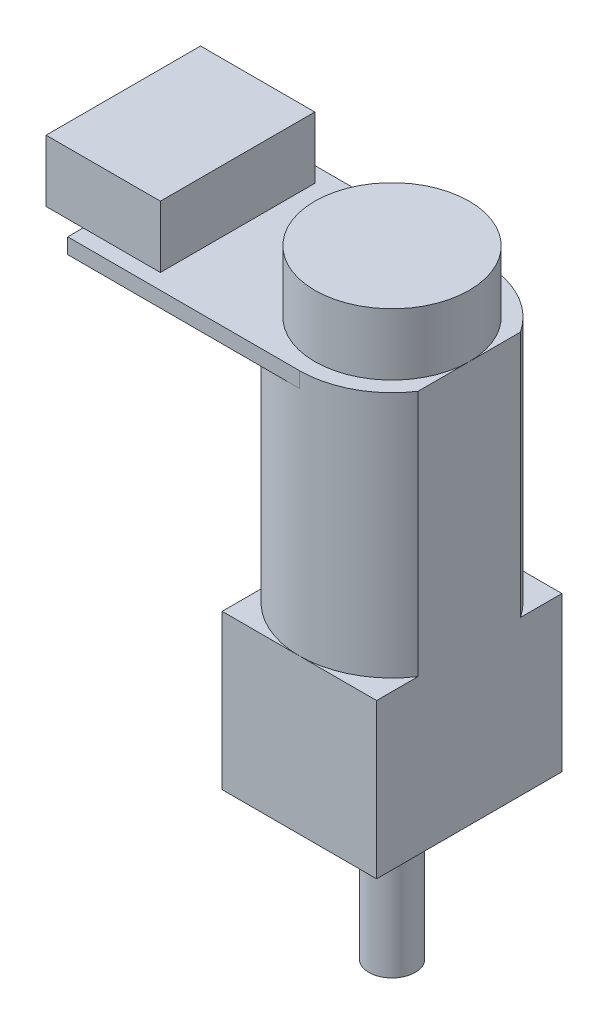
ISO-10303-21;
HEADER;
FILE_DESCRIPTION(('STEP AP214'),'2;1');
FILE_NAME('part.step','',(''),(''),'','','');
FILE_SCHEMA(('AUTOMOTIVE_DESIGN { 1 0 10303 214 1 1 1 1 }'));
ENDSEC;
DATA;
#1=APPLICATION_CONTEXT('core data for automotive mechanical design processes');
#2=APPLICATION_PROTOCOL_DEFINITION('international standard','automotive_design',2000,#1);
#3=PRODUCT_CONTEXT('',#1,'mechanical');
#4=PRODUCT('Part','Part','',(#3));
#5=PRODUCT_RELATED_PRODUCT_CATEGORY('part','',(#4));
#6=PRODUCT_DEFINITION_FORMATION('','',#4);
#7=PRODUCT_DEFINITION_CONTEXT('part definition',#1,'design');
#8=PRODUCT_DEFINITION('design','',#6,#7);
#9=PRODUCT_DEFINITION_SHAPE('','',#8);
#10=(LENGTH_UNIT() NAMED_UNIT(*) SI_UNIT(.MILLI.,.METRE.));
#11=(NAMED_UNIT(*) PLANE_ANGLE_UNIT() SI_UNIT($,.RADIAN.));
#12=(NAMED_UNIT(*) SI_UNIT($,.STERADIAN.) SOLID_ANGLE_UNIT());
#13=UNCERTAINTY_MEASURE_WITH_UNIT(LENGTH_MEASURE(1.E-05),#10,'distance_accuracy_value','');
#14=(GEOMETRIC_REPRESENTATION_CONTEXT(3) GLOBAL_UNCERTAINTY_ASSIGNED_CONTEXT((#13)) GLOBAL_UNIT_ASSIGNED_CONTEXT((#10,
#11,#12)) REPRESENTATION_CONTEXT('',''));
#15=CARTESIAN_POINT('',(0.,0.,0.));
#16=DIRECTION('',(0.,0.,1.));
#17=DIRECTION('',(1.,0.,0.));
#18=AXIS2_PLACEMENT_3D('',#15,#16,#17);
#19=CARTESIAN_POINT('',(0.,16.,0.));
#20=DIRECTION('',(0.,1.,0.));
#21=DIRECTION('',(0.,0.,1.));
#22=AXIS2_PLACEMENT_3D('',#19,#20,#21);
#23=PLANE('',#22);
#24=DIRECTION('',(0.,0.,-1.));
#25=VECTOR('',#24,1.);
#26=CARTESIAN_POINT('',(-10.,16.,-5.));
#27=LINE('',#26,#25);
#28=CARTESIAN_POINT('',(-10.,16.,5.));
#29=VERTEX_POINT('',#28);
#30=CARTESIAN_POINT('',(-10.,16.,-5.));
#31=VERTEX_POINT('',#30);
#32=EDGE_CURVE('E264',#29,#31,#27,.T.);
#33=ORIENTED_EDGE('',*,*,#32,.F.);
#34=DIRECTION('',(-1.,0.,0.));
#35=VECTOR('',#34,1.);
#36=CARTESIAN_POINT('',(0.,16.,5.));
#37=LINE('',#36,#35);
#38=CARTESIAN_POINT('',(-15.,16.,5.));
#39=VERTEX_POINT('',#38);
#40=EDGE_CURVE('E12',#29,#39,#37,.T.);
#41=ORIENTED_EDGE('',*,*,#40,.T.);
#42=DIRECTION('',(0.,0.,1.));
#43=VECTOR('',#42,1.);
#44=CARTESIAN_POINT('',(-15.,16.,6.));
#45=LINE('',#44,#43);
#46=CARTESIAN_POINT('',(-15.,16.,6.));
#47=VERTEX_POINT('',#46);
#48=EDGE_CURVE('E375',#39,#47,#45,.T.);
#49=ORIENTED_EDGE('',*,*,#48,.T.);
#50=DIRECTION('',(1.,0.,0.));
#51=VECTOR('',#50,1.);
#52=CARTESIAN_POINT('',(0.,16.,6.));
#53=LINE('',#52,#51);
#54=CARTESIAN_POINT('',(0.,16.,6.));
#55=VERTEX_POINT('',#54);
#56=EDGE_CURVE('E380',#47,#55,#53,.T.);
#57=ORIENTED_EDGE('',*,*,#56,.T.);
#58=CARTESIAN_POINT('',(0.,16.,0.));
#59=DIRECTION('',(0.,1.,0.));
#60=DIRECTION('',(0.,0.,1.));
#61=AXIS2_PLACEMENT_3D('',#58,#59,#60);
#62=CIRCLE('',#61,6.);
#63=CARTESIAN_POINT('',(5.,16.,3.3166247903554));
#64=VERTEX_POINT('',#63);
#65=EDGE_CURVE('E360',#55,#64,#62,.T.);
#66=ORIENTED_EDGE('',*,*,#65,.T.);
#67=DIRECTION('',(0.,0.,-1.));
#68=VECTOR('',#67,1.);
#69=CARTESIAN_POINT('',(5.,16.,3.3166247903554));
#70=LINE('',#69,#68);
#71=CARTESIAN_POINT('',(5.,16.,0.));
#72=VERTEX_POINT('',#71);
#73=EDGE_CURVE('E366',#64,#72,#70,.T.);
#74=ORIENTED_EDGE('',*,*,#73,.T.);
#75=CARTESIAN_POINT('',(0.,16.,0.));
#76=DIRECTION('',(0.,1.,0.));
#77=DIRECTION('',(0.,0.,1.));
#78=AXIS2_PLACEMENT_3D('',#75,#76,#77);
#79=CIRCLE('',#78,5.);
#80=EDGE_CURVE('E283',#72,#72,#79,.T.);
#81=ORIENTED_EDGE('',*,*,#80,.F.);
#82=CARTESIAN_POINT('',(5.,16.,-3.3166247903554));
#83=VERTEX_POINT('',#82);
#84=EDGE_CURVE('E364',#72,#83,#70,.T.);
#85=ORIENTED_EDGE('',*,*,#84,.T.);
#86=CARTESIAN_POINT('',(0.,16.,0.));
#87=DIRECTION('',(0.,1.,0.));
#88=DIRECTION('',(0.,0.,1.));
#89=AXIS2_PLACEMENT_3D('',#86,#87,#88);
#90=CIRCLE('',#89,6.);
#91=CARTESIAN_POINT('',(0.,16.,-6.));
#92=VERTEX_POINT('',#91);
#93=EDGE_CURVE('E369',#83,#92,#90,.T.);
#94=ORIENTED_EDGE('',*,*,#93,.T.);
#95=DIRECTION('',(-1.,0.,0.));
#96=VECTOR('',#95,1.);
#97=CARTESIAN_POINT('',(0.,16.,-6.));
#98=LINE('',#97,#96);
#99=CARTESIAN_POINT('',(-15.,16.,-6.));
#100=VERTEX_POINT('',#99);
#101=EDGE_CURVE('E372',#92,#100,#98,.T.);
#102=ORIENTED_EDGE('',*,*,#101,.T.);
#103=CARTESIAN_POINT('',(-15.,16.,-5.));
#104=VERTEX_POINT('',#103);
#105=EDGE_CURVE('E376',#100,#104,#45,.T.);
#106=ORIENTED_EDGE('',*,*,#105,.T.);
#107=DIRECTION('',(-1.,0.,0.));
#108=VECTOR('',#107,1.);
#109=CARTESIAN_POINT('',(-17.4,16.,-5.));
#110=LINE('',#109,#108);
#111=EDGE_CURVE('E247',#31,#104,#110,.T.);
#112=ORIENTED_EDGE('',*,*,#111,.F.);
#113=EDGE_LOOP('',(#33,#41,#49,#57,#66,#74,#81,#85,#94,#102,#106,#112));
#114=FACE_BOUND('',#113,.T.);
#115=ADVANCED_FACE('F47',(#114),#23,.T.);
#116=CARTESIAN_POINT('',(0.,15.,0.));
#117=DIRECTION('',(0.,-1.,0.));
#118=DIRECTION('',(0.,0.,-1.));
#119=AXIS2_PLACEMENT_3D('',#116,#117,#118);
#120=CYLINDRICAL_SURFACE('',#119,6.);
#121=DIRECTION('',(0.,-1.,0.));
#122=VECTOR('',#121,1.);
#123=CARTESIAN_POINT('',(5.,15.,3.3166247903554));
#124=LINE('',#123,#122);
#125=CARTESIAN_POINT('',(5.,0.,3.3166247903554));
#126=VERTEX_POINT('',#125);
#127=EDGE_CURVE('E424',#64,#126,#124,.T.);
#128=ORIENTED_EDGE('',*,*,#127,.F.);
#129=ORIENTED_EDGE('',*,*,#65,.F.);
#130=DIRECTION('',(0.,-1.,0.));
#131=VECTOR('',#130,1.);
#132=CARTESIAN_POINT('',(0.,16.,6.));
#133=LINE('',#132,#131);
#134=CARTESIAN_POINT('',(0.,15.,6.));
#135=VERTEX_POINT('',#134);
#136=EDGE_CURVE('E384',#55,#135,#133,.T.);
#137=ORIENTED_EDGE('',*,*,#136,.T.);
#138=CARTESIAN_POINT('',(0.,15.,0.));
#139=DIRECTION('',(0.,1.,0.));
#140=DIRECTION('',(0.,0.,1.));
#141=AXIS2_PLACEMENT_3D('',#138,#139,#140);
#142=CIRCLE('',#141,6.);
#143=CARTESIAN_POINT('',(-5.,15.,3.3166247903554));
#144=VERTEX_POINT('',#143);
#145=EDGE_CURVE('E429',#144,#135,#142,.T.);
#146=ORIENTED_EDGE('',*,*,#145,.F.);
#147=DIRECTION('',(0.,-1.,0.));
#148=VECTOR('',#147,1.);
#149=CARTESIAN_POINT('',(-5.,15.,3.3166247903554));
#150=LINE('',#149,#148);
#151=CARTESIAN_POINT('',(-5.,0.,3.3166247903554));
#152=VERTEX_POINT('',#151);
#153=EDGE_CURVE('E412',#152,#144,#150,.F.);
#154=ORIENTED_EDGE('',*,*,#153,.F.);
#155=CARTESIAN_POINT('',(0.,0.,0.));
#156=DIRECTION('',(0.,1.,0.));
#157=DIRECTION('',(0.,0.,1.));
#158=AXIS2_PLACEMENT_3D('',#155,#156,#157);
#159=CIRCLE('',#158,6.);
#160=CARTESIAN_POINT('',(0.,0.,6.));
#161=VERTEX_POINT('',#160);
#162=EDGE_CURVE('E433',#152,#161,#159,.T.);
#163=ORIENTED_EDGE('',*,*,#162,.T.);
#164=EDGE_CURVE('E428',#161,#126,#159,.T.);
#165=ORIENTED_EDGE('',*,*,#164,.T.);
#166=EDGE_LOOP('',(#128,#129,#137,#146,#154,#163,#165));
#167=FACE_BOUND('',#166,.T.);
#168=ADVANCED_FACE('F49',(#167),#120,.T.);
#169=DIRECTION('',(0.,-1.,0.));
#170=VECTOR('',#169,1.);
#171=CARTESIAN_POINT('',(5.,15.,-3.3166247903554));
#172=LINE('',#171,#170);
#173=CARTESIAN_POINT('',(5.,0.,-3.3166247903554));
#174=VERTEX_POINT('',#173);
#175=EDGE_CURVE('E420',#174,#83,#172,.F.);
#176=ORIENTED_EDGE('',*,*,#175,.F.);
#177=CARTESIAN_POINT('',(0.,0.,-6.));
#178=VERTEX_POINT('',#177);
#179=EDGE_CURVE('E432',#174,#178,#159,.T.);
#180=ORIENTED_EDGE('',*,*,#179,.T.);
#181=CARTESIAN_POINT('',(-5.,0.,-3.3166247903554));
#182=VERTEX_POINT('',#181);
#183=EDGE_CURVE('E436',#178,#182,#159,.T.);
#184=ORIENTED_EDGE('',*,*,#183,.T.);
#185=DIRECTION('',(0.,-1.,0.));
#186=VECTOR('',#185,1.);
#187=CARTESIAN_POINT('',(-5.,15.,-3.3166247903554));
#188=LINE('',#187,#186);
#189=CARTESIAN_POINT('',(-5.,15.,-3.3166247903554));
#190=VERTEX_POINT('',#189);
#191=EDGE_CURVE('E416',#190,#182,#188,.T.);
#192=ORIENTED_EDGE('',*,*,#191,.F.);
#193=CARTESIAN_POINT('',(0.,15.,-6.));
#194=VERTEX_POINT('',#193);
#195=EDGE_CURVE('E310',#194,#190,#142,.T.);
#196=ORIENTED_EDGE('',*,*,#195,.F.);
#197=DIRECTION('',(0.,-1.,0.));
#198=VECTOR('',#197,1.);
#199=CARTESIAN_POINT('',(0.,16.,-6.));
#200=LINE('',#199,#198);
#201=EDGE_CURVE('E404',#92,#194,#200,.T.);
#202=ORIENTED_EDGE('',*,*,#201,.F.);
#203=ORIENTED_EDGE('',*,*,#93,.F.);
#204=EDGE_LOOP('',(#176,#180,#184,#192,#196,#202,#203));
#205=FACE_BOUND('',#204,.T.);
#206=ADVANCED_FACE('F461',(#205),#120,.T.);
#207=CARTESIAN_POINT('',(-5.,0.,8.78121320747622));
#208=DIRECTION('',(-1.,0.,0.));
#209=DIRECTION('',(0.,0.,1.));
#210=AXIS2_PLACEMENT_3D('',#207,#208,#209);
#211=PLANE('',#210);
#212=ORIENTED_EDGE('',*,*,#191,.T.);
#213=DIRECTION('',(0.,0.,-1.));
#214=VECTOR('',#213,1.);
#215=CARTESIAN_POINT('',(-5.,0.,-6.));
#216=LINE('',#215,#214);
#217=CARTESIAN_POINT('',(-5.,0.,-6.));
#218=VERTEX_POINT('',#217);
#219=EDGE_CURVE('E335',#182,#218,#216,.T.);
#220=ORIENTED_EDGE('',*,*,#219,.T.);
#221=DIRECTION('',(0.,1.,0.));
#222=VECTOR('',#221,1.);
#223=CARTESIAN_POINT('',(-5.,-10.,-6.));
#224=LINE('',#223,#222);
#225=CARTESIAN_POINT('',(-5.,-10.,-6.));
#226=VERTEX_POINT('',#225);
#227=EDGE_CURVE('E347',#226,#218,#224,.T.);
#228=ORIENTED_EDGE('',*,*,#227,.F.);
#229=DIRECTION('',(0.,0.,-1.));
#230=VECTOR('',#229,1.);
#231=CARTESIAN_POINT('',(-5.,-10.,-6.));
#232=LINE('',#231,#230);
#233=CARTESIAN_POINT('',(-5.,-10.,6.));
#234=VERTEX_POINT('',#233);
#235=EDGE_CURVE('E319',#234,#226,#232,.T.);
#236=ORIENTED_EDGE('',*,*,#235,.F.);
#237=DIRECTION('',(0.,1.,0.));
#238=VECTOR('',#237,1.);
#239=CARTESIAN_POINT('',(-5.,-10.,6.));
#240=LINE('',#239,#238);
#241=CARTESIAN_POINT('',(-5.,0.,6.));
#242=VERTEX_POINT('',#241);
#243=EDGE_CURVE('E351',#234,#242,#240,.T.);
#244=ORIENTED_EDGE('',*,*,#243,.T.);
#245=EDGE_CURVE('E336',#242,#152,#216,.T.);
#246=ORIENTED_EDGE('',*,*,#245,.T.);
#247=ORIENTED_EDGE('',*,*,#153,.T.);
#248=DIRECTION('',(0.,0.,1.));
#249=VECTOR('',#248,1.);
#250=CARTESIAN_POINT('',(-5.,15.,8.78121320747622));
#251=LINE('',#250,#249);
#252=EDGE_CURVE('E408',#190,#144,#251,.T.);
#253=ORIENTED_EDGE('',*,*,#252,.F.);
#254=EDGE_LOOP('',(#212,#220,#228,#236,#244,#246,#247,#253));
#255=FACE_BOUND('',#254,.T.);
#256=ADVANCED_FACE('F486',(#255),#211,.T.);
#257=CARTESIAN_POINT('',(5.,0.,8.78121320747622));
#258=DIRECTION('',(1.,0.,0.));
#259=DIRECTION('',(0.,0.,-1.));
#260=AXIS2_PLACEMENT_3D('',#257,#258,#259);
#261=PLANE('',#260);
#262=ORIENTED_EDGE('',*,*,#127,.T.);
#263=DIRECTION('',(0.,0.,1.));
#264=VECTOR('',#263,1.);
#265=CARTESIAN_POINT('',(5.,0.,-6.));
#266=LINE('',#265,#264);
#267=CARTESIAN_POINT('',(5.,0.,6.));
#268=VERTEX_POINT('',#267);
#269=EDGE_CURVE('E305',#126,#268,#266,.T.);
#270=ORIENTED_EDGE('',*,*,#269,.T.);
#271=DIRECTION('',(0.,1.,0.));
#272=VECTOR('',#271,1.);
#273=CARTESIAN_POINT('',(5.,-10.,6.));
#274=LINE('',#273,#272);
#275=CARTESIAN_POINT('',(5.,-10.,6.));
#276=VERTEX_POINT('',#275);
#277=EDGE_CURVE('E355',#276,#268,#274,.T.);
#278=ORIENTED_EDGE('',*,*,#277,.F.);
#279=DIRECTION('',(0.,0.,1.));
#280=VECTOR('',#279,1.);
#281=CARTESIAN_POINT('',(5.,-10.,-6.));
#282=LINE('',#281,#280);
#283=CARTESIAN_POINT('',(5.,-10.,-6.));
#284=VERTEX_POINT('',#283);
#285=EDGE_CURVE('E311',#284,#276,#282,.T.);
#286=ORIENTED_EDGE('',*,*,#285,.F.);
#287=DIRECTION('',(0.,1.,0.));
#288=VECTOR('',#287,1.);
#289=CARTESIAN_POINT('',(5.,-10.,-6.));
#290=LINE('',#289,#288);
#291=CARTESIAN_POINT('',(5.,0.,-6.));
#292=VERTEX_POINT('',#291);
#293=EDGE_CURVE('E325',#284,#292,#290,.T.);
#294=ORIENTED_EDGE('',*,*,#293,.T.);
#295=EDGE_CURVE('E326',#292,#174,#266,.T.);
#296=ORIENTED_EDGE('',*,*,#295,.T.);
#297=ORIENTED_EDGE('',*,*,#175,.T.);
#298=ORIENTED_EDGE('',*,*,#84,.F.);
#299=ORIENTED_EDGE('',*,*,#73,.F.);
#300=EDGE_LOOP('',(#262,#270,#278,#286,#294,#296,#297,#298,#299));
#301=FACE_BOUND('',#300,.T.);
#302=ADVANCED_FACE('F472',(#301),#261,.T.);
#303=CARTESIAN_POINT('',(0.,15.,0.));
#304=DIRECTION('',(0.,1.,0.));
#305=DIRECTION('',(0.,0.,1.));
#306=AXIS2_PLACEMENT_3D('',#303,#304,#305);
#307=PLANE('',#306);
#308=ORIENTED_EDGE('',*,*,#252,.T.);
#309=ORIENTED_EDGE('',*,*,#145,.T.);
#310=DIRECTION('',(1.,0.,0.));
#311=VECTOR('',#310,1.);
#312=CARTESIAN_POINT('',(0.,15.,6.));
#313=LINE('',#312,#311);
#314=CARTESIAN_POINT('',(-15.,15.,6.));
#315=VERTEX_POINT('',#314);
#316=EDGE_CURVE('E365',#315,#135,#313,.T.);
#317=ORIENTED_EDGE('',*,*,#316,.F.);
#318=DIRECTION('',(0.,0.,1.));
#319=VECTOR('',#318,1.);
#320=CARTESIAN_POINT('',(-15.,15.,6.));
#321=LINE('',#320,#319);
#322=CARTESIAN_POINT('',(-15.,15.,-6.));
#323=VERTEX_POINT('',#322);
#324=EDGE_CURVE('E387',#323,#315,#321,.T.);
#325=ORIENTED_EDGE('',*,*,#324,.F.);
#326=DIRECTION('',(-1.,0.,0.));
#327=VECTOR('',#326,1.);
#328=CARTESIAN_POINT('',(0.,15.,-6.));
#329=LINE('',#328,#327);
#330=EDGE_CURVE('E359',#194,#323,#329,.T.);
#331=ORIENTED_EDGE('',*,*,#330,.F.);
#332=ORIENTED_EDGE('',*,*,#195,.T.);
#333=EDGE_LOOP('',(#308,#309,#317,#325,#331,#332));
#334=FACE_BOUND('',#333,.T.);
#335=ADVANCED_FACE('F468',(#334),#307,.F.);
#336=CARTESIAN_POINT('',(0.,16.,-6.));
#337=DIRECTION('',(0.,0.,1.));
#338=DIRECTION('',(1.,0.,0.));
#339=AXIS2_PLACEMENT_3D('',#336,#337,#338);
#340=PLANE('',#339);
#341=ORIENTED_EDGE('',*,*,#330,.T.);
#342=DIRECTION('',(0.,-1.,0.));
#343=VECTOR('',#342,1.);
#344=CARTESIAN_POINT('',(-15.,16.,-6.));
#345=LINE('',#344,#343);
#346=EDGE_CURVE('E400',#100,#323,#345,.T.);
#347=ORIENTED_EDGE('',*,*,#346,.F.);
#348=ORIENTED_EDGE('',*,*,#101,.F.);
#349=ORIENTED_EDGE('',*,*,#201,.T.);
#350=EDGE_LOOP('',(#341,#347,#348,#349));
#351=FACE_BOUND('',#350,.T.);
#352=ADVANCED_FACE('F471',(#351),#340,.F.);
#353=CARTESIAN_POINT('',(-15.,16.,6.));
#354=DIRECTION('',(1.,0.,0.));
#355=DIRECTION('',(0.,0.,-1.));
#356=AXIS2_PLACEMENT_3D('',#353,#354,#355);
#357=PLANE('',#356);
#358=ORIENTED_EDGE('',*,*,#324,.T.);
#359=DIRECTION('',(0.,-1.,0.));
#360=VECTOR('',#359,1.);
#361=CARTESIAN_POINT('',(-15.,16.,6.));
#362=LINE('',#361,#360);
#363=EDGE_CURVE('E396',#47,#315,#362,.T.);
#364=ORIENTED_EDGE('',*,*,#363,.F.);
#365=ORIENTED_EDGE('',*,*,#48,.F.);
#366=EDGE_CURVE('E381',#104,#39,#45,.T.);
#367=ORIENTED_EDGE('',*,*,#366,.F.);
#368=ORIENTED_EDGE('',*,*,#105,.F.);
#369=ORIENTED_EDGE('',*,*,#346,.T.);
#370=EDGE_LOOP('',(#358,#364,#365,#367,#368,#369));
#371=FACE_BOUND('',#370,.T.);
#372=ADVANCED_FACE('F478',(#371),#357,.F.);
#373=CARTESIAN_POINT('',(0.,16.,6.));
#374=DIRECTION('',(0.,0.,-1.));
#375=DIRECTION('',(-1.,0.,0.));
#376=AXIS2_PLACEMENT_3D('',#373,#374,#375);
#377=PLANE('',#376);
#378=ORIENTED_EDGE('',*,*,#316,.T.);
#379=ORIENTED_EDGE('',*,*,#136,.F.);
#380=ORIENTED_EDGE('',*,*,#56,.F.);
#381=ORIENTED_EDGE('',*,*,#363,.T.);
#382=EDGE_LOOP('',(#378,#379,#380,#381));
#383=FACE_BOUND('',#382,.T.);
#384=ADVANCED_FACE('F474',(#383),#377,.F.);
#385=CARTESIAN_POINT('',(0.,0.,0.));
#386=DIRECTION('',(0.,1.,0.));
#387=DIRECTION('',(0.,0.,1.));
#388=AXIS2_PLACEMENT_3D('',#385,#386,#387);
#389=PLANE('',#388);
#390=ORIENTED_EDGE('',*,*,#162,.F.);
#391=ORIENTED_EDGE('',*,*,#245,.F.);
#392=DIRECTION('',(-1.,0.,0.));
#393=VECTOR('',#392,1.);
#394=CARTESIAN_POINT('',(-5.,0.,6.));
#395=LINE('',#394,#393);
#396=EDGE_CURVE('E330',#161,#242,#395,.T.);
#397=ORIENTED_EDGE('',*,*,#396,.F.);
#398=EDGE_LOOP('',(#390,#391,#397));
#399=FACE_BOUND('',#398,.T.);
#400=ADVANCED_FACE('F477',(#399),#389,.T.);
#401=ORIENTED_EDGE('',*,*,#164,.F.);
#402=EDGE_CURVE('E331',#268,#161,#395,.T.);
#403=ORIENTED_EDGE('',*,*,#402,.F.);
#404=ORIENTED_EDGE('',*,*,#269,.F.);
#405=EDGE_LOOP('',(#401,#403,#404));
#406=FACE_BOUND('',#405,.T.);
#407=ADVANCED_FACE('F634',(#406),#389,.T.);
#408=ORIENTED_EDGE('',*,*,#179,.F.);
#409=ORIENTED_EDGE('',*,*,#295,.F.);
#410=DIRECTION('',(1.,0.,0.));
#411=VECTOR('',#410,1.);
#412=CARTESIAN_POINT('',(-5.,0.,-6.));
#413=LINE('',#412,#411);
#414=EDGE_CURVE('E340',#178,#292,#413,.T.);
#415=ORIENTED_EDGE('',*,*,#414,.F.);
#416=EDGE_LOOP('',(#408,#409,#415));
#417=FACE_BOUND('',#416,.T.);
#418=ADVANCED_FACE('F530',(#417),#389,.T.);
#419=ORIENTED_EDGE('',*,*,#183,.F.);
#420=EDGE_CURVE('E316',#218,#178,#413,.T.);
#421=ORIENTED_EDGE('',*,*,#420,.F.);
#422=ORIENTED_EDGE('',*,*,#219,.F.);
#423=EDGE_LOOP('',(#419,#421,#422));
#424=FACE_BOUND('',#423,.T.);
#425=ADVANCED_FACE('F535',(#424),#389,.T.);
#426=CARTESIAN_POINT('',(-5.,-10.,6.));
#427=DIRECTION('',(0.,0.,-1.));
#428=DIRECTION('',(-1.,0.,0.));
#429=AXIS2_PLACEMENT_3D('',#426,#427,#428);
#430=PLANE('',#429);
#431=ORIENTED_EDGE('',*,*,#402,.T.);
#432=ORIENTED_EDGE('',*,*,#396,.T.);
#433=ORIENTED_EDGE('',*,*,#243,.F.);
#434=DIRECTION('',(-1.,0.,0.));
#435=VECTOR('',#434,1.);
#436=CARTESIAN_POINT('',(-5.,-10.,6.));
#437=LINE('',#436,#435);
#438=EDGE_CURVE('E315',#276,#234,#437,.T.);
#439=ORIENTED_EDGE('',*,*,#438,.F.);
#440=ORIENTED_EDGE('',*,*,#277,.T.);
#441=EDGE_LOOP('',(#431,#432,#433,#439,#440));
#442=FACE_BOUND('',#441,.T.);
#443=ADVANCED_FACE('F466',(#442),#430,.F.);
#444=CARTESIAN_POINT('',(-5.,-10.,-6.));
#445=DIRECTION('',(0.,0.,1.));
#446=DIRECTION('',(1.,0.,0.));
#447=AXIS2_PLACEMENT_3D('',#444,#445,#446);
#448=PLANE('',#447);
#449=ORIENTED_EDGE('',*,*,#420,.T.);
#450=ORIENTED_EDGE('',*,*,#414,.T.);
#451=ORIENTED_EDGE('',*,*,#293,.F.);
#452=DIRECTION('',(1.,0.,0.));
#453=VECTOR('',#452,1.);
#454=CARTESIAN_POINT('',(-5.,-10.,-6.));
#455=LINE('',#454,#453);
#456=EDGE_CURVE('E322',#226,#284,#455,.T.);
#457=ORIENTED_EDGE('',*,*,#456,.F.);
#458=ORIENTED_EDGE('',*,*,#227,.T.);
#459=EDGE_LOOP('',(#449,#450,#451,#457,#458));
#460=FACE_BOUND('',#459,.T.);
#461=ADVANCED_FACE('F533',(#460),#448,.F.);
#462=CARTESIAN_POINT('',(0.,-10.,0.));
#463=DIRECTION('',(0.,1.,0.));
#464=DIRECTION('',(0.,0.,1.));
#465=AXIS2_PLACEMENT_3D('',#462,#463,#464);
#466=PLANE('',#465);
#467=CARTESIAN_POINT('',(0.,-10.,-5.));
#468=DIRECTION('',(0.,-1.,0.));
#469=DIRECTION('',(0.,0.,-1.));
#470=AXIS2_PLACEMENT_3D('',#467,#468,#469);
#471=CIRCLE('',#470,0.624999999999999);
#472=CARTESIAN_POINT('',(0.,-10.,-5.625));
#473=VERTEX_POINT('',#472);
#474=EDGE_CURVE('E212',#473,#473,#471,.T.);
#475=ORIENTED_EDGE('',*,*,#474,.F.);
#476=EDGE_LOOP('',(#475));
#477=FACE_BOUND('',#476,.T.);
#478=CARTESIAN_POINT('',(0.,-10.,5.));
#479=DIRECTION('',(0.,-1.,0.));
#480=DIRECTION('',(0.,0.,-1.));
#481=AXIS2_PLACEMENT_3D('',#478,#479,#480);
#482=CIRCLE('',#481,0.624999999999999);
#483=CARTESIAN_POINT('',(0.,-10.,4.375));
#484=VERTEX_POINT('',#483);
#485=EDGE_CURVE('E211',#484,#484,#482,.T.);
#486=ORIENTED_EDGE('',*,*,#485,.F.);
#487=EDGE_LOOP('',(#486));
#488=FACE_BOUND('',#487,.T.);
#489=CARTESIAN_POINT('',(2.5,-10.,-3.75));
#490=DIRECTION('',(0.,-1.,0.));
#491=DIRECTION('',(0.,0.,-1.));
#492=AXIS2_PLACEMENT_3D('',#489,#490,#491);
#493=CIRCLE('',#492,0.799999999999999);
#494=CARTESIAN_POINT('',(2.5,-10.,-4.55));
#495=VERTEX_POINT('',#494);
#496=EDGE_CURVE('E225',#495,#495,#493,.T.);
#497=ORIENTED_EDGE('',*,*,#496,.F.);
#498=EDGE_LOOP('',(#497));
#499=FACE_BOUND('',#498,.T.);
#500=CARTESIAN_POINT('',(-2.5,-10.,3.75));
#501=DIRECTION('',(0.,-1.,0.));
#502=DIRECTION('',(0.,0.,-1.));
#503=AXIS2_PLACEMENT_3D('',#500,#501,#502);
#504=CIRCLE('',#503,0.799999999999999);
#505=CARTESIAN_POINT('',(-2.5,-10.,2.95));
#506=VERTEX_POINT('',#505);
#507=EDGE_CURVE('E233',#506,#506,#504,.T.);
#508=ORIENTED_EDGE('',*,*,#507,.F.);
#509=EDGE_LOOP('',(#508));
#510=FACE_BOUND('',#509,.T.);
#511=DIRECTION('',(-1.,0.,0.));
#512=VECTOR('',#511,1.);
#513=CARTESIAN_POINT('',(-2.99669970234591,-10.,-1.));
#514=LINE('',#513,#512);
#515=CARTESIAN_POINT('',(1.1180339887499,-10.,-1.));
#516=VERTEX_POINT('',#515);
#517=CARTESIAN_POINT('',(-1.1180339887499,-10.,-1.));
#518=VERTEX_POINT('',#517);
#519=EDGE_CURVE('E288',#516,#518,#514,.T.);
#520=ORIENTED_EDGE('',*,*,#519,.T.);
#521=CARTESIAN_POINT('',(0.,-10.,0.));
#522=DIRECTION('',(0.,-1.,0.));
#523=DIRECTION('',(0.,0.,-1.));
#524=AXIS2_PLACEMENT_3D('',#521,#522,#523);
#525=CIRCLE('',#524,1.5);
#526=EDGE_CURVE('E306',#516,#518,#525,.T.);
#527=ORIENTED_EDGE('',*,*,#526,.F.);
#528=EDGE_LOOP('',(#520,#527));
#529=FACE_BOUND('',#528,.T.);
#530=ORIENTED_EDGE('',*,*,#285,.T.);
#531=ORIENTED_EDGE('',*,*,#438,.T.);
#532=ORIENTED_EDGE('',*,*,#235,.T.);
#533=ORIENTED_EDGE('',*,*,#456,.T.);
#534=EDGE_LOOP('',(#530,#531,#532,#533));
#535=FACE_BOUND('',#534,.T.);
#536=ADVANCED_FACE('F453',(#477,#488,#499,#510,#529,#535),#466,.F.);
#537=CARTESIAN_POINT('',(0.,-20.,0.));
#538=DIRECTION('',(0.,1.,0.));
#539=DIRECTION('',(0.,0.,1.));
#540=AXIS2_PLACEMENT_3D('',#537,#538,#539);
#541=CYLINDRICAL_SURFACE('',#540,1.5);
#542=CARTESIAN_POINT('',(0.,-20.,0.));
#543=DIRECTION('',(0.,-1.,0.));
#544=DIRECTION('',(0.,0.,-1.));
#545=AXIS2_PLACEMENT_3D('',#542,#543,#544);
#546=CIRCLE('',#545,1.5);
#547=CARTESIAN_POINT('',(1.1180339887499,-20.,-1.));
#548=VERTEX_POINT('',#547);
#549=CARTESIAN_POINT('',(-1.1180339887499,-20.,-1.));
#550=VERTEX_POINT('',#549);
#551=EDGE_CURVE('E301',#548,#550,#546,.T.);
#552=ORIENTED_EDGE('',*,*,#551,.F.);
#553=DIRECTION('',(0.,1.,0.));
#554=VECTOR('',#553,1.);
#555=CARTESIAN_POINT('',(1.1180339887499,-20.,-1.));
#556=LINE('',#555,#554);
#557=EDGE_CURVE('E71',#548,#516,#556,.T.);
#558=ORIENTED_EDGE('',*,*,#557,.T.);
#559=ORIENTED_EDGE('',*,*,#526,.T.);
#560=DIRECTION('',(0.,1.,0.));
#561=VECTOR('',#560,1.);
#562=CARTESIAN_POINT('',(-1.1180339887499,-20.,-1.));
#563=LINE('',#562,#561);
#564=EDGE_CURVE('E295',#518,#550,#563,.F.);
#565=ORIENTED_EDGE('',*,*,#564,.T.);
#566=EDGE_LOOP('',(#552,#558,#559,#565));
#567=FACE_BOUND('',#566,.T.);
#568=ADVANCED_FACE('F442',(#567),#541,.T.);
#569=CARTESIAN_POINT('',(0.,-20.,0.));
#570=DIRECTION('',(0.,-1.,0.));
#571=DIRECTION('',(0.,0.,-1.));
#572=AXIS2_PLACEMENT_3D('',#569,#570,#571);
#573=PLANE('',#572);
#574=DIRECTION('',(-1.,0.,0.));
#575=VECTOR('',#574,1.);
#576=CARTESIAN_POINT('',(0.,-20.,-1.));
#577=LINE('',#576,#575);
#578=EDGE_CURVE('E56',#548,#550,#577,.T.);
#579=ORIENTED_EDGE('',*,*,#578,.F.);
#580=ORIENTED_EDGE('',*,*,#551,.T.);
#581=EDGE_LOOP('',(#579,#580));
#582=FACE_BOUND('',#581,.T.);
#583=ADVANCED_FACE('F444',(#582),#573,.T.);
#584=CARTESIAN_POINT('',(-2.99669970234591,-2.78739656635112,-1.));
#585=DIRECTION('',(0.,0.,1.));
#586=DIRECTION('',(1.,0.,0.));
#587=AXIS2_PLACEMENT_3D('',#584,#585,#586);
#588=PLANE('',#587);
#589=ORIENTED_EDGE('',*,*,#578,.T.);
#590=ORIENTED_EDGE('',*,*,#564,.F.);
#591=ORIENTED_EDGE('',*,*,#519,.F.);
#592=ORIENTED_EDGE('',*,*,#557,.F.);
#593=EDGE_LOOP('',(#589,#590,#591,#592));
#594=FACE_BOUND('',#593,.T.);
#595=ADVANCED_FACE('F438',(#594),#588,.F.);
#596=CARTESIAN_POINT('',(0.,20.,0.));
#597=DIRECTION('',(0.,-1.,0.));
#598=DIRECTION('',(0.,0.,-1.));
#599=AXIS2_PLACEMENT_3D('',#596,#597,#598);
#600=CYLINDRICAL_SURFACE('',#599,5.);
#601=CARTESIAN_POINT('',(0.,20.,0.));
#602=DIRECTION('',(0.,1.,0.));
#603=DIRECTION('',(0.,0.,1.));
#604=AXIS2_PLACEMENT_3D('',#601,#602,#603);
#605=CIRCLE('',#604,5.);
#606=CARTESIAN_POINT('',(0.,20.,5.));
#607=VERTEX_POINT('',#606);
#608=EDGE_CURVE('E284',#607,#607,#605,.T.);
#609=ORIENTED_EDGE('',*,*,#608,.F.);
#610=EDGE_LOOP('',(#609));
#611=FACE_BOUND('',#610,.T.);
#612=ORIENTED_EDGE('',*,*,#80,.T.);
#613=EDGE_LOOP('',(#612));
#614=FACE_BOUND('',#613,.T.);
#615=ADVANCED_FACE('F451',(#611,#614),#600,.T.);
#616=CARTESIAN_POINT('',(0.,20.,0.));
#617=DIRECTION('',(0.,1.,0.));
#618=DIRECTION('',(0.,0.,1.));
#619=AXIS2_PLACEMENT_3D('',#616,#617,#618);
#620=PLANE('',#619);
#621=ORIENTED_EDGE('',*,*,#608,.T.);
#622=EDGE_LOOP('',(#621));
#623=FACE_BOUND('',#622,.T.);
#624=ADVANCED_FACE('F567',(#623),#620,.T.);
#625=CARTESIAN_POINT('',(0.,16.,0.));
#626=DIRECTION('',(0.,1.,0.));
#627=DIRECTION('',(0.,0.,1.));
#628=AXIS2_PLACEMENT_3D('',#625,#626,#627);
#629=PLANE('',#628);
#630=CARTESIAN_POINT('',(-17.4,16.,-5.));
#631=VERTEX_POINT('',#630);
#632=EDGE_CURVE('E267',#104,#631,#110,.T.);
#633=ORIENTED_EDGE('',*,*,#632,.F.);
#634=ORIENTED_EDGE('',*,*,#366,.T.);
#635=DIRECTION('',(1.,0.,0.));
#636=VECTOR('',#635,1.);
#637=CARTESIAN_POINT('',(-17.4,16.,5.));
#638=LINE('',#637,#636);
#639=CARTESIAN_POINT('',(-17.4,16.,5.));
#640=VERTEX_POINT('',#639);
#641=EDGE_CURVE('E260',#640,#39,#638,.T.);
#642=ORIENTED_EDGE('',*,*,#641,.F.);
#643=DIRECTION('',(0.,0.,1.));
#644=VECTOR('',#643,1.);
#645=CARTESIAN_POINT('',(-17.4,16.,-5.));
#646=LINE('',#645,#644);
#647=EDGE_CURVE('E241',#631,#640,#646,.T.);
#648=ORIENTED_EDGE('',*,*,#647,.F.);
#649=EDGE_LOOP('',(#633,#634,#642,#648));
#650=FACE_BOUND('',#649,.T.);
#651=ADVANCED_FACE('F549',(#650),#629,.F.);
#652=CARTESIAN_POINT('',(-17.4,20.,-5.));
#653=DIRECTION('',(1.,0.,0.));
#654=DIRECTION('',(0.,0.,-1.));
#655=AXIS2_PLACEMENT_3D('',#652,#653,#654);
#656=PLANE('',#655);
#657=ORIENTED_EDGE('',*,*,#647,.T.);
#658=DIRECTION('',(0.,-1.,0.));
#659=VECTOR('',#658,1.);
#660=CARTESIAN_POINT('',(-17.4,20.,5.));
#661=LINE('',#660,#659);
#662=CARTESIAN_POINT('',(-17.4,20.,5.));
#663=VERTEX_POINT('',#662);
#664=EDGE_CURVE('E279',#663,#640,#661,.T.);
#665=ORIENTED_EDGE('',*,*,#664,.F.);
#666=DIRECTION('',(0.,0.,1.));
#667=VECTOR('',#666,1.);
#668=CARTESIAN_POINT('',(-17.4,20.,-5.));
#669=LINE('',#668,#667);
#670=CARTESIAN_POINT('',(-17.4,20.,-5.));
#671=VERTEX_POINT('',#670);
#672=EDGE_CURVE('E242',#671,#663,#669,.T.);
#673=ORIENTED_EDGE('',*,*,#672,.F.);
#674=DIRECTION('',(0.,-1.,0.));
#675=VECTOR('',#674,1.);
#676=CARTESIAN_POINT('',(-17.4,20.,-5.));
#677=LINE('',#676,#675);
#678=EDGE_CURVE('E256',#671,#631,#677,.T.);
#679=ORIENTED_EDGE('',*,*,#678,.T.);
#680=EDGE_LOOP('',(#657,#665,#673,#679));
#681=FACE_BOUND('',#680,.T.);
#682=ADVANCED_FACE('F547',(#681),#656,.F.);
#683=CARTESIAN_POINT('',(-17.4,20.,5.));
#684=DIRECTION('',(0.,0.,-1.));
#685=DIRECTION('',(-1.,0.,0.));
#686=AXIS2_PLACEMENT_3D('',#683,#684,#685);
#687=PLANE('',#686);
#688=ORIENTED_EDGE('',*,*,#641,.T.);
#689=ORIENTED_EDGE('',*,*,#40,.F.);
#690=DIRECTION('',(0.,-1.,0.));
#691=VECTOR('',#690,1.);
#692=CARTESIAN_POINT('',(-10.,20.,5.));
#693=LINE('',#692,#691);
#694=CARTESIAN_POINT('',(-10.,20.,5.));
#695=VERTEX_POINT('',#694);
#696=EDGE_CURVE('E275',#695,#29,#693,.T.);
#697=ORIENTED_EDGE('',*,*,#696,.F.);
#698=DIRECTION('',(1.,0.,0.));
#699=VECTOR('',#698,1.);
#700=CARTESIAN_POINT('',(-17.4,20.,5.));
#701=LINE('',#700,#699);
#702=EDGE_CURVE('E246',#663,#695,#701,.T.);
#703=ORIENTED_EDGE('',*,*,#702,.F.);
#704=ORIENTED_EDGE('',*,*,#664,.T.);
#705=EDGE_LOOP('',(#688,#689,#697,#703,#704));
#706=FACE_BOUND('',#705,.T.);
#707=ADVANCED_FACE('F551',(#706),#687,.F.);
#708=CARTESIAN_POINT('',(-10.,20.,-5.));
#709=DIRECTION('',(-1.,0.,0.));
#710=DIRECTION('',(0.,0.,1.));
#711=AXIS2_PLACEMENT_3D('',#708,#709,#710);
#712=PLANE('',#711);
#713=ORIENTED_EDGE('',*,*,#32,.T.);
#714=DIRECTION('',(0.,-1.,0.));
#715=VECTOR('',#714,1.);
#716=CARTESIAN_POINT('',(-10.,20.,-5.));
#717=LINE('',#716,#715);
#718=CARTESIAN_POINT('',(-10.,20.,-5.));
#719=VERTEX_POINT('',#718);
#720=EDGE_CURVE('E63',#719,#31,#717,.T.);
#721=ORIENTED_EDGE('',*,*,#720,.F.);
#722=DIRECTION('',(0.,0.,-1.));
#723=VECTOR('',#722,1.);
#724=CARTESIAN_POINT('',(-10.,20.,-5.));
#725=LINE('',#724,#723);
#726=EDGE_CURVE('E250',#695,#719,#725,.T.);
#727=ORIENTED_EDGE('',*,*,#726,.F.);
#728=ORIENTED_EDGE('',*,*,#696,.T.);
#729=EDGE_LOOP('',(#713,#721,#727,#728));
#730=FACE_BOUND('',#729,.T.);
#731=ADVANCED_FACE('F557',(#730),#712,.F.);
#732=CARTESIAN_POINT('',(-17.4,20.,-5.));
#733=DIRECTION('',(0.,0.,1.));
#734=DIRECTION('',(1.,0.,0.));
#735=AXIS2_PLACEMENT_3D('',#732,#733,#734);
#736=PLANE('',#735);
#737=ORIENTED_EDGE('',*,*,#111,.T.);
#738=ORIENTED_EDGE('',*,*,#632,.T.);
#739=ORIENTED_EDGE('',*,*,#678,.F.);
#740=DIRECTION('',(-1.,0.,0.));
#741=VECTOR('',#740,1.);
#742=CARTESIAN_POINT('',(-17.4,20.,-5.));
#743=LINE('',#742,#741);
#744=EDGE_CURVE('E253',#719,#671,#743,.T.);
#745=ORIENTED_EDGE('',*,*,#744,.F.);
#746=ORIENTED_EDGE('',*,*,#720,.T.);
#747=EDGE_LOOP('',(#737,#738,#739,#745,#746));
#748=FACE_BOUND('',#747,.T.);
#749=ADVANCED_FACE('F541',(#748),#736,.F.);
#750=CARTESIAN_POINT('',(0.,20.,0.));
#751=DIRECTION('',(0.,1.,0.));
#752=DIRECTION('',(0.,0.,1.));
#753=AXIS2_PLACEMENT_3D('',#750,#751,#752);
#754=PLANE('',#753);
#755=ORIENTED_EDGE('',*,*,#672,.T.);
#756=ORIENTED_EDGE('',*,*,#702,.T.);
#757=ORIENTED_EDGE('',*,*,#726,.T.);
#758=ORIENTED_EDGE('',*,*,#744,.T.);
#759=EDGE_LOOP('',(#755,#756,#757,#758));
#760=FACE_BOUND('',#759,.T.);
#761=ADVANCED_FACE('F555',(#760),#754,.T.);
#762=CARTESIAN_POINT('',(-2.5,0.,3.75));
#763=DIRECTION('',(0.,-1.,0.));
#764=DIRECTION('',(0.,0.,-1.));
#765=AXIS2_PLACEMENT_3D('',#762,#763,#764);
#766=CONICAL_SURFACE('',#765,0.799999999999997,1.02974425867665);
#767=CARTESIAN_POINT('',(-2.5,0.480688495222049,3.75));
#768=VERTEX_POINT('',#767);
#769=VERTEX_LOOP('',#768);
#770=FACE_BOUND('',#769,.T.);
#771=CARTESIAN_POINT('',(-2.5,0.,3.75));
#772=DIRECTION('',(0.,-1.,0.));
#773=DIRECTION('',(0.,0.,-1.));
#774=AXIS2_PLACEMENT_3D('',#771,#772,#773);
#775=CIRCLE('',#774,0.799999999999997);
#776=CARTESIAN_POINT('',(-2.5,0.,2.95));
#777=VERTEX_POINT('',#776);
#778=EDGE_CURVE('E237',#777,#777,#775,.T.);
#779=ORIENTED_EDGE('',*,*,#778,.T.);
#780=EDGE_LOOP('',(#779));
#781=FACE_BOUND('',#780,.T.);
#782=ADVANCED_FACE('F589',(#770,#781),#766,.F.);
#783=CARTESIAN_POINT('',(-2.5,-10.,3.75));
#784=DIRECTION('',(0.,-1.,0.));
#785=DIRECTION('',(0.,0.,-1.));
#786=AXIS2_PLACEMENT_3D('',#783,#784,#785);
#787=CYLINDRICAL_SURFACE('',#786,0.799999999999998);
#788=ORIENTED_EDGE('',*,*,#778,.F.);
#789=EDGE_LOOP('',(#788));
#790=FACE_BOUND('',#789,.T.);
#791=ORIENTED_EDGE('',*,*,#507,.T.);
#792=EDGE_LOOP('',(#791));
#793=FACE_BOUND('',#792,.T.);
#794=ADVANCED_FACE('F592',(#790,#793),#787,.F.);
#795=CARTESIAN_POINT('',(2.5,0.,-3.75));
#796=DIRECTION('',(0.,-1.,0.));
#797=DIRECTION('',(0.,0.,-1.));
#798=AXIS2_PLACEMENT_3D('',#795,#796,#797);
#799=CONICAL_SURFACE('',#798,0.799999999999997,1.02974425867665);
#800=CARTESIAN_POINT('',(2.5,0.480688495222049,-3.75));
#801=VERTEX_POINT('',#800);
#802=VERTEX_LOOP('',#801);
#803=FACE_BOUND('',#802,.T.);
#804=CARTESIAN_POINT('',(2.5,0.,-3.75));
#805=DIRECTION('',(0.,-1.,0.));
#806=DIRECTION('',(0.,0.,-1.));
#807=AXIS2_PLACEMENT_3D('',#804,#805,#806);
#808=CIRCLE('',#807,0.799999999999997);
#809=CARTESIAN_POINT('',(2.5,0.,-4.55));
#810=VERTEX_POINT('',#809);
#811=EDGE_CURVE('E229',#810,#810,#808,.T.);
#812=ORIENTED_EDGE('',*,*,#811,.T.);
#813=EDGE_LOOP('',(#812));
#814=FACE_BOUND('',#813,.T.);
#815=ADVANCED_FACE('F596',(#803,#814),#799,.F.);
#816=CARTESIAN_POINT('',(2.5,-10.,-3.75));
#817=DIRECTION('',(0.,-1.,0.));
#818=DIRECTION('',(0.,0.,-1.));
#819=AXIS2_PLACEMENT_3D('',#816,#817,#818);
#820=CYLINDRICAL_SURFACE('',#819,0.799999999999998);
#821=ORIENTED_EDGE('',*,*,#811,.F.);
#822=EDGE_LOOP('',(#821));
#823=FACE_BOUND('',#822,.T.);
#824=ORIENTED_EDGE('',*,*,#496,.T.);
#825=EDGE_LOOP('',(#824));
#826=FACE_BOUND('',#825,.T.);
#827=ADVANCED_FACE('F600',(#823,#826),#820,.F.);
#828=CARTESIAN_POINT('',(0.,-6.,5.));
#829=DIRECTION('',(0.,-1.,0.));
#830=DIRECTION('',(0.,0.,-1.));
#831=AXIS2_PLACEMENT_3D('',#828,#829,#830);
#832=CONICAL_SURFACE('',#831,0.624999999999999,1.02974425867665);
#833=CARTESIAN_POINT('',(0.,-5.62446211310777,5.));
#834=VERTEX_POINT('',#833);
#835=VERTEX_LOOP('',#834);
#836=FACE_BOUND('',#835,.T.);
#837=CARTESIAN_POINT('',(0.,-6.,5.));
#838=DIRECTION('',(0.,-1.,0.));
#839=DIRECTION('',(0.,0.,-1.));
#840=AXIS2_PLACEMENT_3D('',#837,#838,#839);
#841=CIRCLE('',#840,0.624999999999999);
#842=CARTESIAN_POINT('',(0.,-6.,4.375));
#843=VERTEX_POINT('',#842);
#844=EDGE_CURVE('E217',#843,#843,#841,.T.);
#845=ORIENTED_EDGE('',*,*,#844,.T.);
#846=EDGE_LOOP('',(#845));
#847=FACE_BOUND('',#846,.T.);
#848=ADVANCED_FACE('F604',(#836,#847),#832,.F.);
#849=CARTESIAN_POINT('',(0.,-10.,5.));
#850=DIRECTION('',(0.,-1.,0.));
#851=DIRECTION('',(0.,0.,-1.));
#852=AXIS2_PLACEMENT_3D('',#849,#850,#851);
#853=CYLINDRICAL_SURFACE('',#852,0.624999999999999);
#854=ORIENTED_EDGE('',*,*,#844,.F.);
#855=EDGE_LOOP('',(#854));
#856=FACE_BOUND('',#855,.T.);
#857=ORIENTED_EDGE('',*,*,#485,.T.);
#858=EDGE_LOOP('',(#857));
#859=FACE_BOUND('',#858,.T.);
#860=ADVANCED_FACE('F204',(#856,#859),#853,.F.);
#861=CARTESIAN_POINT('',(0.,-6.,-5.));
#862=DIRECTION('',(0.,-1.,0.));
#863=DIRECTION('',(0.,0.,-1.));
#864=AXIS2_PLACEMENT_3D('',#861,#862,#863);
#865=CONICAL_SURFACE('',#864,0.624999999999999,1.02974425867665);
#866=CARTESIAN_POINT('',(0.,-5.62446211310777,-5.));
#867=VERTEX_POINT('',#866);
#868=VERTEX_LOOP('',#867);
#869=FACE_BOUND('',#868,.T.);
#870=CARTESIAN_POINT('',(0.,-6.,-5.));
#871=DIRECTION('',(0.,-1.,0.));
#872=DIRECTION('',(0.,0.,-1.));
#873=AXIS2_PLACEMENT_3D('',#870,#871,#872);
#874=CIRCLE('',#873,0.624999999999999);
#875=CARTESIAN_POINT('',(0.,-6.,-5.625));
#876=VERTEX_POINT('',#875);
#877=EDGE_CURVE('E208',#876,#876,#874,.T.);
#878=ORIENTED_EDGE('',*,*,#877,.T.);
#879=EDGE_LOOP('',(#878));
#880=FACE_BOUND('',#879,.T.);
#881=ADVANCED_FACE('F200',(#869,#880),#865,.F.);
#882=CARTESIAN_POINT('',(0.,-10.,-5.));
#883=DIRECTION('',(0.,-1.,0.));
#884=DIRECTION('',(0.,0.,-1.));
#885=AXIS2_PLACEMENT_3D('',#882,#883,#884);
#886=CYLINDRICAL_SURFACE('',#885,0.624999999999999);
#887=ORIENTED_EDGE('',*,*,#877,.F.);
#888=EDGE_LOOP('',(#887));
#889=FACE_BOUND('',#888,.T.);
#890=ORIENTED_EDGE('',*,*,#474,.T.);
#891=EDGE_LOOP('',(#890));
#892=FACE_BOUND('',#891,.T.);
#893=ADVANCED_FACE('F203',(#889,#892),#886,.F.);
#894=CLOSED_SHELL('',(#115,#168,#206,#256,#302,#335,#352,#372,#384,#400,#407,#418,#425,#443,
#461,#536,#568,#583,#595,#615,#624,#651,#682,#707,#731,#749,#761,#782,#794,#815,#827,#848,#860,
#881,#893));
#895=MANIFOLD_SOLID_BREP('B2',#894);
#896=ADVANCED_BREP_SHAPE_REPRESENTATION('',(#18,#895),#14);
#897=SHAPE_DEFINITION_REPRESENTATION(#9,#896);
ENDSEC;
END-ISO-10303-21;
